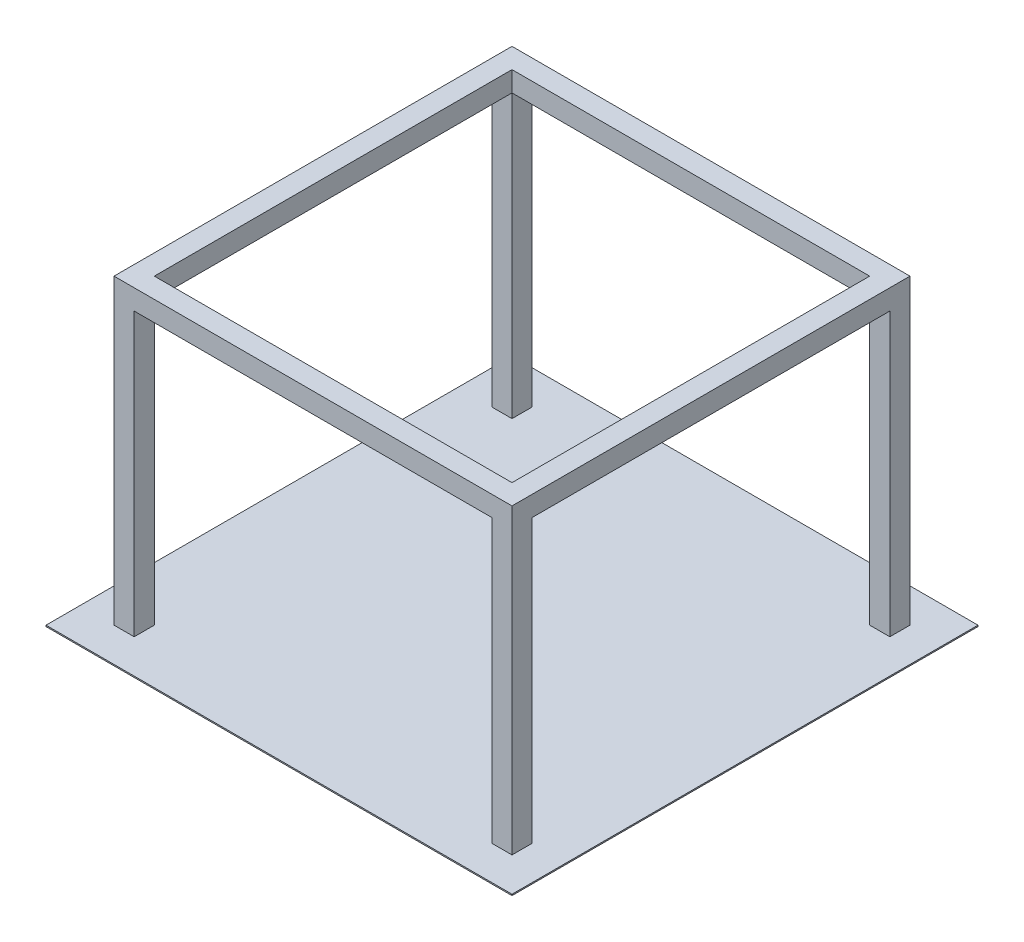
ISO-10303-21;
HEADER;
FILE_DESCRIPTION(('STEP AP214'),'2;1');
FILE_NAME('part.step','',(''),(''),'','','');
FILE_SCHEMA(('AUTOMOTIVE_DESIGN { 1 0 10303 214 1 1 1 1 }'));
ENDSEC;
DATA;
#1=APPLICATION_CONTEXT('core data for automotive mechanical design processes');
#2=APPLICATION_PROTOCOL_DEFINITION('international standard','automotive_design',2000,#1);
#3=PRODUCT_CONTEXT('',#1,'mechanical');
#4=PRODUCT('Part','Part','',(#3));
#5=PRODUCT_RELATED_PRODUCT_CATEGORY('part','',(#4));
#6=PRODUCT_DEFINITION_FORMATION('','',#4);
#7=PRODUCT_DEFINITION_CONTEXT('part definition',#1,'design');
#8=PRODUCT_DEFINITION('design','',#6,#7);
#9=PRODUCT_DEFINITION_SHAPE('','',#8);
#10=(LENGTH_UNIT() NAMED_UNIT(*) SI_UNIT(.MILLI.,.METRE.));
#11=(NAMED_UNIT(*) PLANE_ANGLE_UNIT() SI_UNIT($,.RADIAN.));
#12=(NAMED_UNIT(*) SI_UNIT($,.STERADIAN.) SOLID_ANGLE_UNIT());
#13=UNCERTAINTY_MEASURE_WITH_UNIT(LENGTH_MEASURE(1.E-05),#10,'distance_accuracy_value','');
#14=(GEOMETRIC_REPRESENTATION_CONTEXT(3) GLOBAL_UNCERTAINTY_ASSIGNED_CONTEXT((#13)) GLOBAL_UNIT_ASSIGNED_CONTEXT((#10,
#11,#12)) REPRESENTATION_CONTEXT('',''));
#15=CARTESIAN_POINT('',(0.,0.,0.));
#16=DIRECTION('',(0.,0.,1.));
#17=DIRECTION('',(1.,0.,0.));
#18=AXIS2_PLACEMENT_3D('',#15,#16,#17);
#19=CARTESIAN_POINT('',(-710.,1125.,-925.));
#20=DIRECTION('',(0.,1.,0.));
#21=DIRECTION('',(0.,0.,1.));
#22=AXIS2_PLACEMENT_3D('',#19,#20,#21);
#23=PLANE('',#22);
#24=DIRECTION('',(1.,0.,0.));
#25=VECTOR('',#24,1.);
#26=CARTESIAN_POINT('',(-925.,1125.,710.));
#27=LINE('',#26,#25);
#28=CARTESIAN_POINT('',(710.,1125.,710.));
#29=VERTEX_POINT('',#28);
#30=CARTESIAN_POINT('',(790.,1125.,710.));
#31=VERTEX_POINT('',#30);
#32=EDGE_CURVE('E206',#29,#31,#27,.T.);
#33=ORIENTED_EDGE('',*,*,#32,.F.);
#34=DIRECTION('',(0.,0.,1.));
#35=VECTOR('',#34,1.);
#36=CARTESIAN_POINT('',(710.,1125.,-710.));
#37=LINE('',#36,#35);
#38=CARTESIAN_POINT('',(710.,1125.,-710.));
#39=VERTEX_POINT('',#38);
#40=EDGE_CURVE('E179',#39,#29,#37,.T.);
#41=ORIENTED_EDGE('',*,*,#40,.F.);
#42=DIRECTION('',(1.,0.,0.));
#43=VECTOR('',#42,1.);
#44=CARTESIAN_POINT('',(-925.,1125.,-710.));
#45=LINE('',#44,#43);
#46=CARTESIAN_POINT('',(790.,1125.,-710.));
#47=VERTEX_POINT('',#46);
#48=EDGE_CURVE('E203',#39,#47,#45,.T.);
#49=ORIENTED_EDGE('',*,*,#48,.T.);
#50=DIRECTION('',(0.,0.,-1.));
#51=VECTOR('',#50,1.);
#52=CARTESIAN_POINT('',(790.,1125.,790.));
#53=LINE('',#52,#51);
#54=EDGE_CURVE('E378',#31,#47,#53,.T.);
#55=ORIENTED_EDGE('',*,*,#54,.F.);
#56=EDGE_LOOP('',(#33,#41,#49,#55));
#57=FACE_BOUND('',#56,.T.);
#58=ADVANCED_FACE('F50',(#57),#23,.F.);
#59=DIRECTION('',(0.,0.,1.));
#60=VECTOR('',#59,1.);
#61=CARTESIAN_POINT('',(-710.,1125.,-925.));
#62=LINE('',#61,#60);
#63=CARTESIAN_POINT('',(-710.,1125.,710.));
#64=VERTEX_POINT('',#63);
#65=CARTESIAN_POINT('',(-710.,1125.,790.));
#66=VERTEX_POINT('',#65);
#67=EDGE_CURVE('E234',#64,#66,#62,.T.);
#68=ORIENTED_EDGE('',*,*,#67,.F.);
#69=DIRECTION('',(-1.,0.,0.));
#70=VECTOR('',#69,1.);
#71=CARTESIAN_POINT('',(-710.,1125.,710.));
#72=LINE('',#71,#70);
#73=EDGE_CURVE('E209',#29,#64,#72,.T.);
#74=ORIENTED_EDGE('',*,*,#73,.F.);
#75=DIRECTION('',(0.,0.,1.));
#76=VECTOR('',#75,1.);
#77=CARTESIAN_POINT('',(710.,1125.,-925.));
#78=LINE('',#77,#76);
#79=CARTESIAN_POINT('',(710.,1125.,790.));
#80=VERTEX_POINT('',#79);
#81=EDGE_CURVE('E235',#29,#80,#78,.T.);
#82=ORIENTED_EDGE('',*,*,#81,.T.);
#83=DIRECTION('',(1.,0.,0.));
#84=VECTOR('',#83,1.);
#85=CARTESIAN_POINT('',(-790.,1125.,790.));
#86=LINE('',#85,#84);
#87=EDGE_CURVE('E229',#66,#80,#86,.T.);
#88=ORIENTED_EDGE('',*,*,#87,.F.);
#89=EDGE_LOOP('',(#68,#74,#82,#88));
#90=FACE_BOUND('',#89,.T.);
#91=ADVANCED_FACE('F327',(#90),#23,.F.);
#92=CARTESIAN_POINT('',(-790.,1125.,-710.));
#93=VERTEX_POINT('',#92);
#94=CARTESIAN_POINT('',(-710.,1125.,-710.));
#95=VERTEX_POINT('',#94);
#96=EDGE_CURVE('E218',#93,#95,#45,.T.);
#97=ORIENTED_EDGE('',*,*,#96,.T.);
#98=DIRECTION('',(0.,0.,-1.));
#99=VECTOR('',#98,1.);
#100=CARTESIAN_POINT('',(-710.,1125.,-710.));
#101=LINE('',#100,#99);
#102=EDGE_CURVE('E442',#64,#95,#101,.T.);
#103=ORIENTED_EDGE('',*,*,#102,.F.);
#104=CARTESIAN_POINT('',(-790.,1125.,710.));
#105=VERTEX_POINT('',#104);
#106=EDGE_CURVE('E368',#105,#64,#27,.T.);
#107=ORIENTED_EDGE('',*,*,#106,.F.);
#108=DIRECTION('',(0.,0.,1.));
#109=VECTOR('',#108,1.);
#110=CARTESIAN_POINT('',(-790.,1125.,790.));
#111=LINE('',#110,#109);
#112=EDGE_CURVE('E374',#93,#105,#111,.T.);
#113=ORIENTED_EDGE('',*,*,#112,.F.);
#114=EDGE_LOOP('',(#97,#103,#107,#113));
#115=FACE_BOUND('',#114,.T.);
#116=ADVANCED_FACE('F447',(#115),#23,.F.);
#117=CARTESIAN_POINT('',(0.,5.,0.));
#118=DIRECTION('',(0.,-1.,0.));
#119=DIRECTION('',(0.,0.,-1.));
#120=AXIS2_PLACEMENT_3D('',#117,#118,#119);
#121=PLANE('',#120);
#122=DIRECTION('',(1.,0.,0.));
#123=VECTOR('',#122,1.);
#124=CARTESIAN_POINT('',(-925.,5.,710.));
#125=LINE('',#124,#123);
#126=CARTESIAN_POINT('',(-790.,5.,710.));
#127=VERTEX_POINT('',#126);
#128=CARTESIAN_POINT('',(-710.,5.,710.));
#129=VERTEX_POINT('',#128);
#130=EDGE_CURVE('E356',#127,#129,#125,.T.);
#131=ORIENTED_EDGE('',*,*,#130,.T.);
#132=DIRECTION('',(0.,0.,-1.));
#133=VECTOR('',#132,1.);
#134=CARTESIAN_POINT('',(-710.,5.,0.));
#135=LINE('',#134,#133);
#136=CARTESIAN_POINT('',(-710.,5.,790.));
#137=VERTEX_POINT('',#136);
#138=EDGE_CURVE('E314',#137,#129,#135,.T.);
#139=ORIENTED_EDGE('',*,*,#138,.F.);
#140=DIRECTION('',(1.,0.,0.));
#141=VECTOR('',#140,1.);
#142=CARTESIAN_POINT('',(-790.,5.,790.));
#143=LINE('',#142,#141);
#144=CARTESIAN_POINT('',(-790.,5.,790.));
#145=VERTEX_POINT('',#144);
#146=EDGE_CURVE('E267',#145,#137,#143,.T.);
#147=ORIENTED_EDGE('',*,*,#146,.F.);
#148=DIRECTION('',(0.,0.,1.));
#149=VECTOR('',#148,1.);
#150=CARTESIAN_POINT('',(-790.,5.,790.));
#151=LINE('',#150,#149);
#152=EDGE_CURVE('E286',#127,#145,#151,.T.);
#153=ORIENTED_EDGE('',*,*,#152,.F.);
#154=EDGE_LOOP('',(#131,#139,#147,#153));
#155=FACE_BOUND('',#154,.T.);
#156=ADVANCED_FACE('F409',(#155),#121,.T.);
#157=CARTESIAN_POINT('',(710.,5.,710.));
#158=VERTEX_POINT('',#157);
#159=CARTESIAN_POINT('',(790.,5.,710.));
#160=VERTEX_POINT('',#159);
#161=EDGE_CURVE('E196',#158,#160,#125,.T.);
#162=ORIENTED_EDGE('',*,*,#161,.T.);
#163=DIRECTION('',(0.,0.,-1.));
#164=VECTOR('',#163,1.);
#165=CARTESIAN_POINT('',(790.,5.,790.));
#166=LINE('',#165,#164);
#167=CARTESIAN_POINT('',(790.,5.,790.));
#168=VERTEX_POINT('',#167);
#169=EDGE_CURVE('E277',#168,#160,#166,.T.);
#170=ORIENTED_EDGE('',*,*,#169,.F.);
#171=CARTESIAN_POINT('',(710.,5.,790.));
#172=VERTEX_POINT('',#171);
#173=EDGE_CURVE('E291',#172,#168,#143,.T.);
#174=ORIENTED_EDGE('',*,*,#173,.F.);
#175=DIRECTION('',(0.,0.,1.));
#176=VECTOR('',#175,1.);
#177=CARTESIAN_POINT('',(710.,5.,0.));
#178=LINE('',#177,#176);
#179=EDGE_CURVE('E310',#158,#172,#178,.T.);
#180=ORIENTED_EDGE('',*,*,#179,.F.);
#181=EDGE_LOOP('',(#162,#170,#174,#180));
#182=FACE_BOUND('',#181,.T.);
#183=ADVANCED_FACE('F394',(#182),#121,.T.);
#184=CARTESIAN_POINT('',(-710.,5.,-925.));
#185=DIRECTION('',(-1.,0.,0.));
#186=DIRECTION('',(0.,-1.,0.));
#187=AXIS2_PLACEMENT_3D('',#184,#185,#186);
#188=PLANE('',#187);
#189=ORIENTED_EDGE('',*,*,#138,.T.);
#190=DIRECTION('',(0.,1.,0.));
#191=VECTOR('',#190,1.);
#192=CARTESIAN_POINT('',(-710.,4.99999999999984,710.));
#193=LINE('',#192,#191);
#194=EDGE_CURVE('E381',#129,#64,#193,.T.);
#195=ORIENTED_EDGE('',*,*,#194,.T.);
#196=ORIENTED_EDGE('',*,*,#67,.T.);
#197=DIRECTION('',(0.,1.,0.));
#198=VECTOR('',#197,1.);
#199=CARTESIAN_POINT('',(-710.,1205.,790.));
#200=LINE('',#199,#198);
#201=EDGE_CURVE('E251',#137,#66,#200,.T.);
#202=ORIENTED_EDGE('',*,*,#201,.F.);
#203=EDGE_LOOP('',(#189,#195,#196,#202));
#204=FACE_BOUND('',#203,.T.);
#205=ADVANCED_FACE('F411',(#204),#188,.F.);
#206=CARTESIAN_POINT('',(710.,5.,-925.));
#207=DIRECTION('',(1.,0.,0.));
#208=DIRECTION('',(0.,0.,-1.));
#209=AXIS2_PLACEMENT_3D('',#206,#207,#208);
#210=PLANE('',#209);
#211=ORIENTED_EDGE('',*,*,#81,.F.);
#212=DIRECTION('',(0.,-1.,0.));
#213=VECTOR('',#212,1.);
#214=CARTESIAN_POINT('',(710.,4.99999999999984,710.));
#215=LINE('',#214,#213);
#216=EDGE_CURVE('E12',#29,#158,#215,.T.);
#217=ORIENTED_EDGE('',*,*,#216,.T.);
#218=ORIENTED_EDGE('',*,*,#179,.T.);
#219=DIRECTION('',(0.,-1.,0.));
#220=VECTOR('',#219,1.);
#221=CARTESIAN_POINT('',(710.,1205.,790.));
#222=LINE('',#221,#220);
#223=EDGE_CURVE('E244',#80,#172,#222,.T.);
#224=ORIENTED_EDGE('',*,*,#223,.F.);
#225=EDGE_LOOP('',(#211,#217,#218,#224));
#226=FACE_BOUND('',#225,.T.);
#227=ADVANCED_FACE('F331',(#226),#210,.F.);
#228=DIRECTION('',(1.,0.,0.));
#229=VECTOR('',#228,1.);
#230=CARTESIAN_POINT('',(-925.,5.,-710.));
#231=LINE('',#230,#229);
#232=CARTESIAN_POINT('',(-790.,5.,-710.));
#233=VERTEX_POINT('',#232);
#234=CARTESIAN_POINT('',(-710.,5.,-710.));
#235=VERTEX_POINT('',#234);
#236=EDGE_CURVE('E74',#233,#235,#231,.T.);
#237=ORIENTED_EDGE('',*,*,#236,.F.);
#238=CARTESIAN_POINT('',(-790.,5.,-790.));
#239=VERTEX_POINT('',#238);
#240=EDGE_CURVE('E287',#239,#233,#151,.T.);
#241=ORIENTED_EDGE('',*,*,#240,.F.);
#242=DIRECTION('',(-1.,0.,0.));
#243=VECTOR('',#242,1.);
#244=CARTESIAN_POINT('',(-790.,5.,-790.));
#245=LINE('',#244,#243);
#246=CARTESIAN_POINT('',(-710.,5.,-790.));
#247=VERTEX_POINT('',#246);
#248=EDGE_CURVE('E281',#247,#239,#245,.T.);
#249=ORIENTED_EDGE('',*,*,#248,.F.);
#250=EDGE_CURVE('E313',#235,#247,#135,.T.);
#251=ORIENTED_EDGE('',*,*,#250,.F.);
#252=EDGE_LOOP('',(#237,#241,#249,#251));
#253=FACE_BOUND('',#252,.T.);
#254=ADVANCED_FACE('F454',(#253),#121,.T.);
#255=CARTESIAN_POINT('',(790.,1205.,790.));
#256=DIRECTION('',(-1.,0.,0.));
#257=DIRECTION('',(0.,0.,1.));
#258=AXIS2_PLACEMENT_3D('',#255,#256,#257);
#259=PLANE('',#258);
#260=ORIENTED_EDGE('',*,*,#169,.T.);
#261=DIRECTION('',(0.,1.,0.));
#262=VECTOR('',#261,1.);
#263=CARTESIAN_POINT('',(790.,1205.,710.));
#264=LINE('',#263,#262);
#265=EDGE_CURVE('E241',#160,#31,#264,.T.);
#266=ORIENTED_EDGE('',*,*,#265,.T.);
#267=ORIENTED_EDGE('',*,*,#54,.T.);
#268=DIRECTION('',(0.,-1.,0.));
#269=VECTOR('',#268,1.);
#270=CARTESIAN_POINT('',(790.,1205.,-710.));
#271=LINE('',#270,#269);
#272=CARTESIAN_POINT('',(790.,5.,-710.));
#273=VERTEX_POINT('',#272);
#274=EDGE_CURVE('E216',#47,#273,#271,.T.);
#275=ORIENTED_EDGE('',*,*,#274,.T.);
#276=CARTESIAN_POINT('',(790.,5.,-790.));
#277=VERTEX_POINT('',#276);
#278=EDGE_CURVE('E261',#273,#277,#166,.T.);
#279=ORIENTED_EDGE('',*,*,#278,.T.);
#280=DIRECTION('',(0.,-1.,0.));
#281=VECTOR('',#280,1.);
#282=CARTESIAN_POINT('',(790.,1205.,-790.));
#283=LINE('',#282,#281);
#284=CARTESIAN_POINT('',(790.,1205.,-790.));
#285=VERTEX_POINT('',#284);
#286=EDGE_CURVE('E306',#285,#277,#283,.T.);
#287=ORIENTED_EDGE('',*,*,#286,.F.);
#288=DIRECTION('',(0.,0.,-1.));
#289=VECTOR('',#288,1.);
#290=CARTESIAN_POINT('',(790.,1205.,790.));
#291=LINE('',#290,#289);
#292=CARTESIAN_POINT('',(790.,1205.,790.));
#293=VERTEX_POINT('',#292);
#294=EDGE_CURVE('E262',#293,#285,#291,.T.);
#295=ORIENTED_EDGE('',*,*,#294,.F.);
#296=DIRECTION('',(0.,-1.,0.));
#297=VECTOR('',#296,1.);
#298=CARTESIAN_POINT('',(790.,1205.,790.));
#299=LINE('',#298,#297);
#300=EDGE_CURVE('E276',#293,#168,#299,.T.);
#301=ORIENTED_EDGE('',*,*,#300,.T.);
#302=EDGE_LOOP('',(#260,#266,#267,#275,#279,#287,#295,#301));
#303=FACE_BOUND('',#302,.T.);
#304=ADVANCED_FACE('F52',(#303),#259,.F.);
#305=CARTESIAN_POINT('',(-790.,1205.,-790.));
#306=DIRECTION('',(0.,0.,1.));
#307=DIRECTION('',(1.,0.,0.));
#308=AXIS2_PLACEMENT_3D('',#305,#306,#307);
#309=PLANE('',#308);
#310=DIRECTION('',(-1.,0.,0.));
#311=VECTOR('',#310,1.);
#312=CARTESIAN_POINT('',(-790.,1125.,-790.));
#313=LINE('',#312,#311);
#314=CARTESIAN_POINT('',(710.,1125.,-790.));
#315=VERTEX_POINT('',#314);
#316=CARTESIAN_POINT('',(-710.,1125.,-790.));
#317=VERTEX_POINT('',#316);
#318=EDGE_CURVE('E232',#315,#317,#313,.T.);
#319=ORIENTED_EDGE('',*,*,#318,.T.);
#320=DIRECTION('',(0.,-1.,0.));
#321=VECTOR('',#320,1.);
#322=CARTESIAN_POINT('',(-710.,1205.,-790.));
#323=LINE('',#322,#321);
#324=EDGE_CURVE('E255',#317,#247,#323,.T.);
#325=ORIENTED_EDGE('',*,*,#324,.T.);
#326=ORIENTED_EDGE('',*,*,#248,.T.);
#327=DIRECTION('',(0.,-1.,0.));
#328=VECTOR('',#327,1.);
#329=CARTESIAN_POINT('',(-790.,1205.,-790.));
#330=LINE('',#329,#328);
#331=CARTESIAN_POINT('',(-790.,1205.,-790.));
#332=VERTEX_POINT('',#331);
#333=EDGE_CURVE('E302',#332,#239,#330,.T.);
#334=ORIENTED_EDGE('',*,*,#333,.F.);
#335=DIRECTION('',(-1.,0.,0.));
#336=VECTOR('',#335,1.);
#337=CARTESIAN_POINT('',(-790.,1205.,-790.));
#338=LINE('',#337,#336);
#339=EDGE_CURVE('E266',#285,#332,#338,.T.);
#340=ORIENTED_EDGE('',*,*,#339,.F.);
#341=ORIENTED_EDGE('',*,*,#286,.T.);
#342=CARTESIAN_POINT('',(710.,5.,-790.));
#343=VERTEX_POINT('',#342);
#344=EDGE_CURVE('E282',#277,#343,#245,.T.);
#345=ORIENTED_EDGE('',*,*,#344,.T.);
#346=DIRECTION('',(0.,1.,0.));
#347=VECTOR('',#346,1.);
#348=CARTESIAN_POINT('',(710.,1205.,-790.));
#349=LINE('',#348,#347);
#350=EDGE_CURVE('E248',#343,#315,#349,.T.);
#351=ORIENTED_EDGE('',*,*,#350,.T.);
#352=EDGE_LOOP('',(#319,#325,#326,#334,#340,#341,#345,#351));
#353=FACE_BOUND('',#352,.T.);
#354=ADVANCED_FACE('F348',(#353),#309,.F.);
#355=CARTESIAN_POINT('',(-790.,1205.,790.));
#356=DIRECTION('',(1.,0.,0.));
#357=DIRECTION('',(0.,0.,-1.));
#358=AXIS2_PLACEMENT_3D('',#355,#356,#357);
#359=PLANE('',#358);
#360=ORIENTED_EDGE('',*,*,#112,.T.);
#361=DIRECTION('',(0.,-1.,0.));
#362=VECTOR('',#361,1.);
#363=CARTESIAN_POINT('',(-790.,1205.,710.));
#364=LINE('',#363,#362);
#365=EDGE_CURVE('E385',#105,#127,#364,.T.);
#366=ORIENTED_EDGE('',*,*,#365,.T.);
#367=ORIENTED_EDGE('',*,*,#152,.T.);
#368=DIRECTION('',(0.,-1.,0.));
#369=VECTOR('',#368,1.);
#370=CARTESIAN_POINT('',(-790.,1205.,790.));
#371=LINE('',#370,#369);
#372=CARTESIAN_POINT('',(-790.,1205.,790.));
#373=VERTEX_POINT('',#372);
#374=EDGE_CURVE('E298',#373,#145,#371,.T.);
#375=ORIENTED_EDGE('',*,*,#374,.F.);
#376=DIRECTION('',(0.,0.,1.));
#377=VECTOR('',#376,1.);
#378=CARTESIAN_POINT('',(-790.,1205.,790.));
#379=LINE('',#378,#377);
#380=EDGE_CURVE('E270',#332,#373,#379,.T.);
#381=ORIENTED_EDGE('',*,*,#380,.F.);
#382=ORIENTED_EDGE('',*,*,#333,.T.);
#383=ORIENTED_EDGE('',*,*,#240,.T.);
#384=DIRECTION('',(0.,1.,0.));
#385=VECTOR('',#384,1.);
#386=CARTESIAN_POINT('',(-790.,1205.,-710.));
#387=LINE('',#386,#385);
#388=EDGE_CURVE('E367',#233,#93,#387,.T.);
#389=ORIENTED_EDGE('',*,*,#388,.T.);
#390=EDGE_LOOP('',(#360,#366,#367,#375,#381,#382,#383,#389));
#391=FACE_BOUND('',#390,.T.);
#392=ADVANCED_FACE('F451',(#391),#359,.F.);
#393=CARTESIAN_POINT('',(-790.,1205.,790.));
#394=DIRECTION('',(0.,0.,-1.));
#395=DIRECTION('',(-1.,0.,0.));
#396=AXIS2_PLACEMENT_3D('',#393,#394,#395);
#397=PLANE('',#396);
#398=ORIENTED_EDGE('',*,*,#146,.T.);
#399=ORIENTED_EDGE('',*,*,#201,.T.);
#400=ORIENTED_EDGE('',*,*,#87,.T.);
#401=ORIENTED_EDGE('',*,*,#223,.T.);
#402=ORIENTED_EDGE('',*,*,#173,.T.);
#403=ORIENTED_EDGE('',*,*,#300,.F.);
#404=DIRECTION('',(1.,0.,0.));
#405=VECTOR('',#404,1.);
#406=CARTESIAN_POINT('',(-790.,1205.,790.));
#407=LINE('',#406,#405);
#408=EDGE_CURVE('E273',#373,#293,#407,.T.);
#409=ORIENTED_EDGE('',*,*,#408,.F.);
#410=ORIENTED_EDGE('',*,*,#374,.T.);
#411=EDGE_LOOP('',(#398,#399,#400,#401,#402,#403,#409,#410));
#412=FACE_BOUND('',#411,.T.);
#413=ADVANCED_FACE('F322',(#412),#397,.F.);
#414=CARTESIAN_POINT('',(0.,1205.,0.));
#415=DIRECTION('',(0.,-1.,0.));
#416=DIRECTION('',(0.,0.,-1.));
#417=AXIS2_PLACEMENT_3D('',#414,#415,#416);
#418=PLANE('',#417);
#419=DIRECTION('',(-1.,0.,0.));
#420=VECTOR('',#419,1.);
#421=CARTESIAN_POINT('',(-710.,1205.,-710.));
#422=LINE('',#421,#420);
#423=CARTESIAN_POINT('',(710.,1205.,-710.));
#424=VERTEX_POINT('',#423);
#425=CARTESIAN_POINT('',(-710.,1205.,-710.));
#426=VERTEX_POINT('',#425);
#427=EDGE_CURVE('E435',#424,#426,#422,.T.);
#428=ORIENTED_EDGE('',*,*,#427,.F.);
#429=DIRECTION('',(0.,0.,-1.));
#430=VECTOR('',#429,1.);
#431=CARTESIAN_POINT('',(710.,1205.,-710.));
#432=LINE('',#431,#430);
#433=CARTESIAN_POINT('',(710.,1205.,710.));
#434=VERTEX_POINT('',#433);
#435=EDGE_CURVE('E66',#434,#424,#432,.T.);
#436=ORIENTED_EDGE('',*,*,#435,.F.);
#437=DIRECTION('',(1.,0.,0.));
#438=VECTOR('',#437,1.);
#439=CARTESIAN_POINT('',(-710.,1205.,710.));
#440=LINE('',#439,#438);
#441=CARTESIAN_POINT('',(-710.,1205.,710.));
#442=VERTEX_POINT('',#441);
#443=EDGE_CURVE('E186',#442,#434,#440,.T.);
#444=ORIENTED_EDGE('',*,*,#443,.F.);
#445=DIRECTION('',(0.,0.,1.));
#446=VECTOR('',#445,1.);
#447=CARTESIAN_POINT('',(-710.,1205.,-710.));
#448=LINE('',#447,#446);
#449=EDGE_CURVE('E431',#426,#442,#448,.T.);
#450=ORIENTED_EDGE('',*,*,#449,.F.);
#451=EDGE_LOOP('',(#428,#436,#444,#450));
#452=FACE_BOUND('',#451,.T.);
#453=ORIENTED_EDGE('',*,*,#294,.T.);
#454=ORIENTED_EDGE('',*,*,#339,.T.);
#455=ORIENTED_EDGE('',*,*,#380,.T.);
#456=ORIENTED_EDGE('',*,*,#408,.T.);
#457=EDGE_LOOP('',(#453,#454,#455,#456));
#458=FACE_BOUND('',#457,.T.);
#459=ADVANCED_FACE('F400',(#452,#458),#418,.F.);
#460=CARTESIAN_POINT('',(710.,5.,-710.));
#461=VERTEX_POINT('',#460);
#462=EDGE_CURVE('E354',#461,#273,#231,.T.);
#463=ORIENTED_EDGE('',*,*,#462,.F.);
#464=EDGE_CURVE('E227',#343,#461,#178,.T.);
#465=ORIENTED_EDGE('',*,*,#464,.F.);
#466=ORIENTED_EDGE('',*,*,#344,.F.);
#467=ORIENTED_EDGE('',*,*,#278,.F.);
#468=EDGE_LOOP('',(#463,#465,#466,#467));
#469=FACE_BOUND('',#468,.T.);
#470=ADVANCED_FACE('F352',(#469),#121,.T.);
#471=EDGE_CURVE('E224',#315,#39,#78,.T.);
#472=ORIENTED_EDGE('',*,*,#471,.T.);
#473=DIRECTION('',(1.,0.,0.));
#474=VECTOR('',#473,1.);
#475=CARTESIAN_POINT('',(-710.,1125.,-710.));
#476=LINE('',#475,#474);
#477=EDGE_CURVE('E190',#95,#39,#476,.T.);
#478=ORIENTED_EDGE('',*,*,#477,.F.);
#479=EDGE_CURVE('E239',#317,#95,#62,.T.);
#480=ORIENTED_EDGE('',*,*,#479,.F.);
#481=ORIENTED_EDGE('',*,*,#318,.F.);
#482=EDGE_LOOP('',(#472,#478,#480,#481));
#483=FACE_BOUND('',#482,.T.);
#484=ADVANCED_FACE('F230',(#483),#23,.F.);
#485=ORIENTED_EDGE('',*,*,#479,.T.);
#486=DIRECTION('',(0.,-1.,0.));
#487=VECTOR('',#486,1.);
#488=CARTESIAN_POINT('',(-710.,5.,-710.));
#489=LINE('',#488,#487);
#490=EDGE_CURVE('E345',#95,#235,#489,.T.);
#491=ORIENTED_EDGE('',*,*,#490,.T.);
#492=ORIENTED_EDGE('',*,*,#250,.T.);
#493=ORIENTED_EDGE('',*,*,#324,.F.);
#494=EDGE_LOOP('',(#485,#491,#492,#493));
#495=FACE_BOUND('',#494,.T.);
#496=ADVANCED_FACE('F344',(#495),#188,.F.);
#497=ORIENTED_EDGE('',*,*,#464,.T.);
#498=DIRECTION('',(0.,1.,0.));
#499=VECTOR('',#498,1.);
#500=CARTESIAN_POINT('',(710.,5.,-710.));
#501=LINE('',#500,#499);
#502=EDGE_CURVE('E59',#461,#39,#501,.T.);
#503=ORIENTED_EDGE('',*,*,#502,.T.);
#504=ORIENTED_EDGE('',*,*,#471,.F.);
#505=ORIENTED_EDGE('',*,*,#350,.F.);
#506=EDGE_LOOP('',(#497,#503,#504,#505));
#507=FACE_BOUND('',#506,.T.);
#508=ADVANCED_FACE('F223',(#507),#210,.F.);
#509=CARTESIAN_POINT('',(-925.,5.,-710.));
#510=DIRECTION('',(0.,0.,-1.));
#511=DIRECTION('',(-1.,0.,0.));
#512=AXIS2_PLACEMENT_3D('',#509,#510,#511);
#513=PLANE('',#512);
#514=ORIENTED_EDGE('',*,*,#48,.F.);
#515=ORIENTED_EDGE('',*,*,#502,.F.);
#516=ORIENTED_EDGE('',*,*,#462,.T.);
#517=ORIENTED_EDGE('',*,*,#274,.F.);
#518=EDGE_LOOP('',(#514,#515,#516,#517));
#519=FACE_BOUND('',#518,.T.);
#520=ADVANCED_FACE('F213',(#519),#513,.F.);
#521=CARTESIAN_POINT('',(-925.,5.,710.));
#522=DIRECTION('',(0.,0.,1.));
#523=DIRECTION('',(0.,-1.,0.));
#524=AXIS2_PLACEMENT_3D('',#521,#522,#523);
#525=PLANE('',#524);
#526=ORIENTED_EDGE('',*,*,#161,.F.);
#527=ORIENTED_EDGE('',*,*,#216,.F.);
#528=ORIENTED_EDGE('',*,*,#32,.T.);
#529=ORIENTED_EDGE('',*,*,#265,.F.);
#530=EDGE_LOOP('',(#526,#527,#528,#529));
#531=FACE_BOUND('',#530,.T.);
#532=ADVANCED_FACE('F393',(#531),#525,.F.);
#533=ORIENTED_EDGE('',*,*,#106,.T.);
#534=ORIENTED_EDGE('',*,*,#194,.F.);
#535=ORIENTED_EDGE('',*,*,#130,.F.);
#536=ORIENTED_EDGE('',*,*,#365,.F.);
#537=EDGE_LOOP('',(#533,#534,#535,#536));
#538=FACE_BOUND('',#537,.T.);
#539=ADVANCED_FACE('F414',(#538),#525,.F.);
#540=ORIENTED_EDGE('',*,*,#236,.T.);
#541=ORIENTED_EDGE('',*,*,#490,.F.);
#542=ORIENTED_EDGE('',*,*,#96,.F.);
#543=ORIENTED_EDGE('',*,*,#388,.F.);
#544=EDGE_LOOP('',(#540,#541,#542,#543));
#545=FACE_BOUND('',#544,.T.);
#546=ADVANCED_FACE('F450',(#545),#513,.F.);
#547=CARTESIAN_POINT('',(710.,-0.000999999999917733,-710.));
#548=DIRECTION('',(1.,0.,0.));
#549=DIRECTION('',(0.,0.,-1.));
#550=AXIS2_PLACEMENT_3D('',#547,#548,#549);
#551=PLANE('',#550);
#552=ORIENTED_EDGE('',*,*,#40,.T.);
#553=DIRECTION('',(0.,1.,0.));
#554=VECTOR('',#553,1.);
#555=CARTESIAN_POINT('',(710.,-0.000999999999917733,710.));
#556=LINE('',#555,#554);
#557=EDGE_CURVE('E197',#29,#434,#556,.T.);
#558=ORIENTED_EDGE('',*,*,#557,.T.);
#559=ORIENTED_EDGE('',*,*,#435,.T.);
#560=DIRECTION('',(0.,1.,0.));
#561=VECTOR('',#560,1.);
#562=CARTESIAN_POINT('',(710.,-0.000999999999917733,-710.));
#563=LINE('',#562,#561);
#564=EDGE_CURVE('E175',#39,#424,#563,.T.);
#565=ORIENTED_EDGE('',*,*,#564,.F.);
#566=EDGE_LOOP('',(#552,#558,#559,#565));
#567=FACE_BOUND('',#566,.T.);
#568=ADVANCED_FACE('F177',(#567),#551,.F.);
#569=CARTESIAN_POINT('',(-710.,-0.000999999999917733,710.));
#570=DIRECTION('',(0.,0.,1.));
#571=DIRECTION('',(1.,0.,0.));
#572=AXIS2_PLACEMENT_3D('',#569,#570,#571);
#573=PLANE('',#572);
#574=ORIENTED_EDGE('',*,*,#73,.T.);
#575=DIRECTION('',(0.,1.,0.));
#576=VECTOR('',#575,1.);
#577=CARTESIAN_POINT('',(-710.,-0.000999999999917733,710.));
#578=LINE('',#577,#576);
#579=EDGE_CURVE('E423',#64,#442,#578,.T.);
#580=ORIENTED_EDGE('',*,*,#579,.T.);
#581=ORIENTED_EDGE('',*,*,#443,.T.);
#582=ORIENTED_EDGE('',*,*,#557,.F.);
#583=EDGE_LOOP('',(#574,#580,#581,#582));
#584=FACE_BOUND('',#583,.T.);
#585=ADVANCED_FACE('F565',(#584),#573,.F.);
#586=CARTESIAN_POINT('',(-710.,-0.000999999999917733,-710.));
#587=DIRECTION('',(-1.,0.,0.));
#588=DIRECTION('',(0.,0.,1.));
#589=AXIS2_PLACEMENT_3D('',#586,#587,#588);
#590=PLANE('',#589);
#591=ORIENTED_EDGE('',*,*,#102,.T.);
#592=DIRECTION('',(0.,1.,0.));
#593=VECTOR('',#592,1.);
#594=CARTESIAN_POINT('',(-710.,-0.000999999999917733,-710.));
#595=LINE('',#594,#593);
#596=EDGE_CURVE('E185',#95,#426,#595,.T.);
#597=ORIENTED_EDGE('',*,*,#596,.T.);
#598=ORIENTED_EDGE('',*,*,#449,.T.);
#599=ORIENTED_EDGE('',*,*,#579,.F.);
#600=EDGE_LOOP('',(#591,#597,#598,#599));
#601=FACE_BOUND('',#600,.T.);
#602=ADVANCED_FACE('F445',(#601),#590,.F.);
#603=CARTESIAN_POINT('',(-710.,-0.000999999999917733,-710.));
#604=DIRECTION('',(0.,0.,-1.));
#605=DIRECTION('',(-1.,0.,0.));
#606=AXIS2_PLACEMENT_3D('',#603,#604,#605);
#607=PLANE('',#606);
#608=ORIENTED_EDGE('',*,*,#477,.T.);
#609=ORIENTED_EDGE('',*,*,#564,.T.);
#610=ORIENTED_EDGE('',*,*,#427,.T.);
#611=ORIENTED_EDGE('',*,*,#596,.F.);
#612=EDGE_LOOP('',(#608,#609,#610,#611));
#613=FACE_BOUND('',#612,.T.);
#614=ADVANCED_FACE('F191',(#613),#607,.F.);
#615=CLOSED_SHELL('',(#58,#91,#116,#156,#183,#205,#227,#254,#304,#354,#392,#413,#459,#470,#484,
#496,#508,#520,#532,#539,#546,#568,#585,#602,#614));
#616=MANIFOLD_SOLID_BREP('B2',#615);
#617=CARTESIAN_POINT('',(925.,5.,-925.));
#618=DIRECTION('',(-1.,0.,0.));
#619=DIRECTION('',(0.,0.,1.));
#620=AXIS2_PLACEMENT_3D('',#617,#618,#619);
#621=PLANE('',#620);
#622=DIRECTION('',(0.,0.,-1.));
#623=VECTOR('',#622,1.);
#624=CARTESIAN_POINT('',(925.,0.,-925.));
#625=LINE('',#624,#623);
#626=CARTESIAN_POINT('',(925.,0.,925.));
#627=VERTEX_POINT('',#626);
#628=CARTESIAN_POINT('',(925.,0.,-925.));
#629=VERTEX_POINT('',#628);
#630=EDGE_CURVE('E725',#627,#629,#625,.T.);
#631=ORIENTED_EDGE('',*,*,#630,.T.);
#632=DIRECTION('',(0.,-1.,0.));
#633=VECTOR('',#632,1.);
#634=CARTESIAN_POINT('',(925.,5.,-925.));
#635=LINE('',#634,#633);
#636=CARTESIAN_POINT('',(925.,5.,-925.));
#637=VERTEX_POINT('',#636);
#638=EDGE_CURVE('E48',#637,#629,#635,.T.);
#639=ORIENTED_EDGE('',*,*,#638,.F.);
#640=DIRECTION('',(0.,0.,-1.));
#641=VECTOR('',#640,1.);
#642=CARTESIAN_POINT('',(925.,5.,-925.));
#643=LINE('',#642,#641);
#644=CARTESIAN_POINT('',(925.,5.,925.));
#645=VERTEX_POINT('',#644);
#646=EDGE_CURVE('E713',#645,#637,#643,.T.);
#647=ORIENTED_EDGE('',*,*,#646,.F.);
#648=DIRECTION('',(0.,-1.,0.));
#649=VECTOR('',#648,1.);
#650=CARTESIAN_POINT('',(925.,5.,925.));
#651=LINE('',#650,#649);
#652=EDGE_CURVE('E721',#645,#627,#651,.T.);
#653=ORIENTED_EDGE('',*,*,#652,.T.);
#654=EDGE_LOOP('',(#631,#639,#647,#653));
#655=FACE_BOUND('',#654,.T.);
#656=ADVANCED_FACE('F662',(#655),#621,.F.);
#657=CARTESIAN_POINT('',(-925.,5.,-925.));
#658=DIRECTION('',(0.,0.,1.));
#659=DIRECTION('',(1.,0.,0.));
#660=AXIS2_PLACEMENT_3D('',#657,#658,#659);
#661=PLANE('',#660);
#662=DIRECTION('',(-1.,0.,0.));
#663=VECTOR('',#662,1.);
#664=CARTESIAN_POINT('',(-925.,0.,-925.));
#665=LINE('',#664,#663);
#666=CARTESIAN_POINT('',(-925.,0.,-925.));
#667=VERTEX_POINT('',#666);
#668=EDGE_CURVE('E717',#629,#667,#665,.T.);
#669=ORIENTED_EDGE('',*,*,#668,.T.);
#670=DIRECTION('',(0.,-1.,0.));
#671=VECTOR('',#670,1.);
#672=CARTESIAN_POINT('',(-925.,5.,-925.));
#673=LINE('',#672,#671);
#674=CARTESIAN_POINT('',(-925.,5.,-925.));
#675=VERTEX_POINT('',#674);
#676=EDGE_CURVE('E670',#675,#667,#673,.T.);
#677=ORIENTED_EDGE('',*,*,#676,.F.);
#678=DIRECTION('',(-1.,0.,0.));
#679=VECTOR('',#678,1.);
#680=CARTESIAN_POINT('',(-925.,5.,-925.));
#681=LINE('',#680,#679);
#682=EDGE_CURVE('E708',#637,#675,#681,.T.);
#683=ORIENTED_EDGE('',*,*,#682,.F.);
#684=ORIENTED_EDGE('',*,*,#638,.T.);
#685=EDGE_LOOP('',(#669,#677,#683,#684));
#686=FACE_BOUND('',#685,.T.);
#687=ADVANCED_FACE('F716',(#686),#661,.F.);
#688=CARTESIAN_POINT('',(-925.,5.,-925.));
#689=DIRECTION('',(1.,0.,0.));
#690=DIRECTION('',(0.,0.,-1.));
#691=AXIS2_PLACEMENT_3D('',#688,#689,#690);
#692=PLANE('',#691);
#693=DIRECTION('',(0.,0.,1.));
#694=VECTOR('',#693,1.);
#695=CARTESIAN_POINT('',(-925.,0.,-925.));
#696=LINE('',#695,#694);
#697=CARTESIAN_POINT('',(-925.,0.,925.));
#698=VERTEX_POINT('',#697);
#699=EDGE_CURVE('E695',#667,#698,#696,.T.);
#700=ORIENTED_EDGE('',*,*,#699,.T.);
#701=DIRECTION('',(0.,-1.,0.));
#702=VECTOR('',#701,1.);
#703=CARTESIAN_POINT('',(-925.,5.,925.));
#704=LINE('',#703,#702);
#705=CARTESIAN_POINT('',(-925.,5.,925.));
#706=VERTEX_POINT('',#705);
#707=EDGE_CURVE('E718',#706,#698,#704,.T.);
#708=ORIENTED_EDGE('',*,*,#707,.F.);
#709=DIRECTION('',(0.,0.,1.));
#710=VECTOR('',#709,1.);
#711=CARTESIAN_POINT('',(-925.,5.,-925.));
#712=LINE('',#711,#710);
#713=EDGE_CURVE('E711',#675,#706,#712,.T.);
#714=ORIENTED_EDGE('',*,*,#713,.F.);
#715=ORIENTED_EDGE('',*,*,#676,.T.);
#716=EDGE_LOOP('',(#700,#708,#714,#715));
#717=FACE_BOUND('',#716,.T.);
#718=ADVANCED_FACE('F719',(#717),#692,.F.);
#719=CARTESIAN_POINT('',(-925.,5.,925.));
#720=DIRECTION('',(0.,0.,-1.));
#721=DIRECTION('',(-1.,0.,0.));
#722=AXIS2_PLACEMENT_3D('',#719,#720,#721);
#723=PLANE('',#722);
#724=DIRECTION('',(1.,0.,0.));
#725=VECTOR('',#724,1.);
#726=CARTESIAN_POINT('',(-925.,0.,925.));
#727=LINE('',#726,#725);
#728=EDGE_CURVE('E701',#698,#627,#727,.T.);
#729=ORIENTED_EDGE('',*,*,#728,.T.);
#730=ORIENTED_EDGE('',*,*,#652,.F.);
#731=DIRECTION('',(1.,0.,0.));
#732=VECTOR('',#731,1.);
#733=CARTESIAN_POINT('',(-925.,5.,925.));
#734=LINE('',#733,#732);
#735=EDGE_CURVE('E678',#706,#645,#734,.T.);
#736=ORIENTED_EDGE('',*,*,#735,.F.);
#737=ORIENTED_EDGE('',*,*,#707,.T.);
#738=EDGE_LOOP('',(#729,#730,#736,#737));
#739=FACE_BOUND('',#738,.T.);
#740=ADVANCED_FACE('F732',(#739),#723,.F.);
#741=CARTESIAN_POINT('',(0.,5.,0.));
#742=DIRECTION('',(0.,1.,0.));
#743=DIRECTION('',(0.,0.,1.));
#744=AXIS2_PLACEMENT_3D('',#741,#742,#743);
#745=PLANE('',#744);
#746=ORIENTED_EDGE('',*,*,#646,.T.);
#747=ORIENTED_EDGE('',*,*,#682,.T.);
#748=ORIENTED_EDGE('',*,*,#713,.T.);
#749=ORIENTED_EDGE('',*,*,#735,.T.);
#750=EDGE_LOOP('',(#746,#747,#748,#749));
#751=FACE_BOUND('',#750,.T.);
#752=ADVANCED_FACE('F709',(#751),#745,.T.);
#753=CARTESIAN_POINT('',(0.,0.,0.));
#754=DIRECTION('',(0.,1.,0.));
#755=DIRECTION('',(0.,0.,1.));
#756=AXIS2_PLACEMENT_3D('',#753,#754,#755);
#757=PLANE('',#756);
#758=ORIENTED_EDGE('',*,*,#630,.F.);
#759=ORIENTED_EDGE('',*,*,#728,.F.);
#760=ORIENTED_EDGE('',*,*,#699,.F.);
#761=ORIENTED_EDGE('',*,*,#668,.F.);
#762=EDGE_LOOP('',(#758,#759,#760,#761));
#763=FACE_BOUND('',#762,.T.);
#764=ADVANCED_FACE('F735',(#763),#757,.F.);
#765=CLOSED_SHELL('',(#656,#687,#718,#740,#752,#764));
#766=MANIFOLD_SOLID_BREP('B6',#765);
#767=ADVANCED_BREP_SHAPE_REPRESENTATION('',(#18,#616,#766),#14);
#768=SHAPE_DEFINITION_REPRESENTATION(#9,#767);
ENDSEC;
END-ISO-10303-21;
